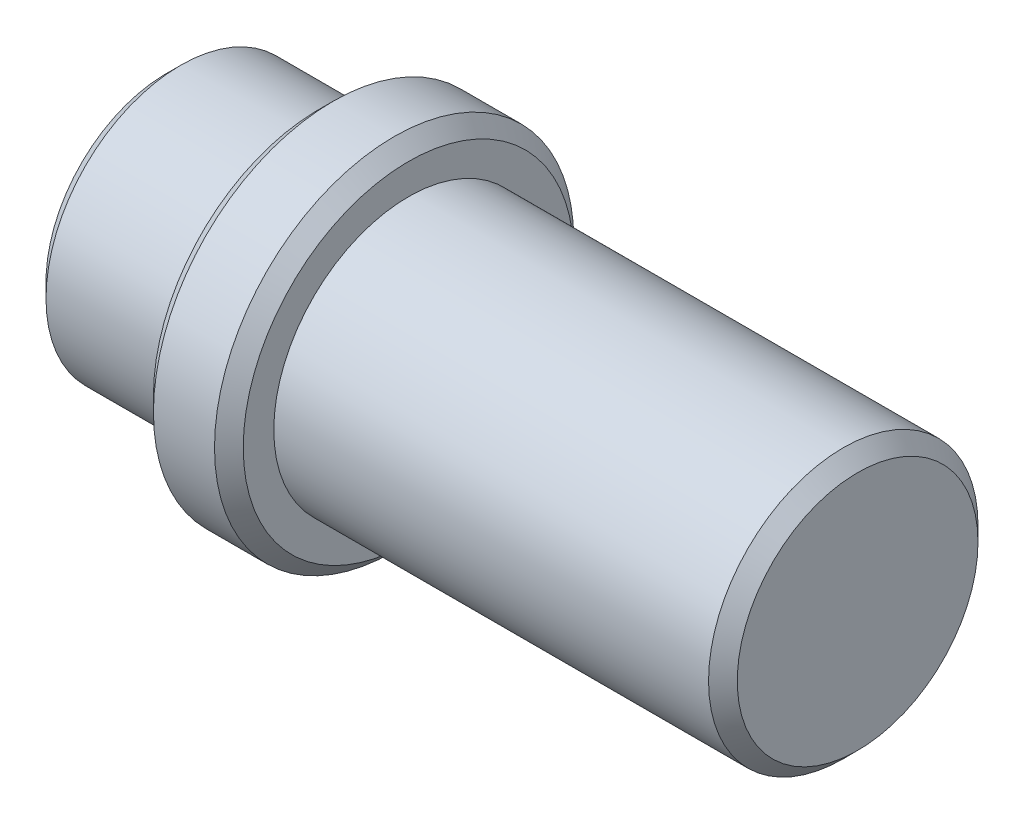
ISO-10303-21;
HEADER;
FILE_DESCRIPTION(('STEP AP214'),'2;1');
FILE_NAME('part.step','',(''),(''),'','','');
FILE_SCHEMA(('AUTOMOTIVE_DESIGN { 1 0 10303 214 1 1 1 1 }'));
ENDSEC;
DATA;
#1=APPLICATION_CONTEXT('core data for automotive mechanical design processes');
#2=APPLICATION_PROTOCOL_DEFINITION('international standard','automotive_design',2000,#1);
#3=PRODUCT_CONTEXT('',#1,'mechanical');
#4=PRODUCT('Part','Part','',(#3));
#5=PRODUCT_RELATED_PRODUCT_CATEGORY('part','',(#4));
#6=PRODUCT_DEFINITION_FORMATION('','',#4);
#7=PRODUCT_DEFINITION_CONTEXT('part definition',#1,'design');
#8=PRODUCT_DEFINITION('design','',#6,#7);
#9=PRODUCT_DEFINITION_SHAPE('','',#8);
#10=(LENGTH_UNIT() NAMED_UNIT(*) SI_UNIT(.MILLI.,.METRE.));
#11=(NAMED_UNIT(*) PLANE_ANGLE_UNIT() SI_UNIT($,.RADIAN.));
#12=(NAMED_UNIT(*) SI_UNIT($,.STERADIAN.) SOLID_ANGLE_UNIT());
#13=UNCERTAINTY_MEASURE_WITH_UNIT(LENGTH_MEASURE(1.E-05),#10,'distance_accuracy_value','');
#14=(GEOMETRIC_REPRESENTATION_CONTEXT(3) GLOBAL_UNCERTAINTY_ASSIGNED_CONTEXT((#13)) GLOBAL_UNIT_ASSIGNED_CONTEXT((#10,
#11,#12)) REPRESENTATION_CONTEXT('',''));
#15=CARTESIAN_POINT('',(0.,0.,0.));
#16=DIRECTION('',(0.,0.,1.));
#17=DIRECTION('',(1.,0.,0.));
#18=AXIS2_PLACEMENT_3D('',#15,#16,#17);
#19=CARTESIAN_POINT('',(12.2174,0.,0.));
#20=DIRECTION('',(-1.,0.,0.));
#21=DIRECTION('',(0.,0.,1.));
#22=AXIS2_PLACEMENT_3D('',#19,#20,#21);
#23=CYLINDRICAL_SURFACE('',#22,2.38125);
#24=CARTESIAN_POINT('',(11.9634,0.,0.));
#25=DIRECTION('',(1.,0.,0.));
#26=DIRECTION('',(0.,0.,-1.));
#27=AXIS2_PLACEMENT_3D('',#24,#25,#26);
#28=CIRCLE('',#27,2.38125);
#29=CARTESIAN_POINT('',(11.9634,0.,-2.38125));
#30=VERTEX_POINT('',#29);
#31=EDGE_CURVE('E10',#30,#30,#28,.F.);
#32=ORIENTED_EDGE('',*,*,#31,.T.);
#33=EDGE_LOOP('',(#32));
#34=FACE_BOUND('',#33,.T.);
#35=CARTESIAN_POINT('',(4.2799,0.,0.));
#36=DIRECTION('',(-1.,0.,0.));
#37=DIRECTION('',(0.,0.,1.));
#38=AXIS2_PLACEMENT_3D('',#35,#36,#37);
#39=CIRCLE('',#38,2.38125);
#40=CARTESIAN_POINT('',(4.2799,0.,2.38125));
#41=VERTEX_POINT('',#40);
#42=EDGE_CURVE('E64',#41,#41,#39,.T.);
#43=ORIENTED_EDGE('',*,*,#42,.F.);
#44=EDGE_LOOP('',(#43));
#45=FACE_BOUND('',#44,.T.);
#46=ADVANCED_FACE('F32',(#34,#45),#23,.T.);
#47=CARTESIAN_POINT('',(12.2174,0.,0.));
#48=DIRECTION('',(1.,0.,0.));
#49=DIRECTION('',(0.,0.,-1.));
#50=AXIS2_PLACEMENT_3D('',#47,#48,#49);
#51=PLANE('',#50);
#52=CARTESIAN_POINT('',(12.2174,0.,0.));
#53=DIRECTION('',(1.,0.,0.));
#54=DIRECTION('',(0.,0.,-1.));
#55=AXIS2_PLACEMENT_3D('',#52,#53,#54);
#56=CIRCLE('',#55,2.12725);
#57=CARTESIAN_POINT('',(12.2174,0.,-2.12725));
#58=VERTEX_POINT('',#57);
#59=EDGE_CURVE('E39',#58,#58,#56,.T.);
#60=ORIENTED_EDGE('',*,*,#59,.T.);
#61=EDGE_LOOP('',(#60));
#62=FACE_BOUND('',#61,.T.);
#63=ADVANCED_FACE('F86',(#62),#51,.T.);
#64=CARTESIAN_POINT('',(4.2799,0.,0.));
#65=DIRECTION('',(-1.,0.,0.));
#66=DIRECTION('',(0.,0.,1.));
#67=AXIS2_PLACEMENT_3D('',#64,#65,#66);
#68=PLANE('',#67);
#69=CARTESIAN_POINT('',(4.2799,0.,0.));
#70=DIRECTION('',(-1.,0.,0.));
#71=DIRECTION('',(0.,0.,1.));
#72=AXIS2_PLACEMENT_3D('',#69,#70,#71);
#73=CIRCLE('',#72,2.921);
#74=CARTESIAN_POINT('',(4.2799,0.,2.921));
#75=VERTEX_POINT('',#74);
#76=EDGE_CURVE('E55',#75,#75,#73,.F.);
#77=ORIENTED_EDGE('',*,*,#76,.T.);
#78=EDGE_LOOP('',(#77));
#79=FACE_BOUND('',#78,.T.);
#80=ORIENTED_EDGE('',*,*,#42,.T.);
#81=EDGE_LOOP('',(#80));
#82=FACE_BOUND('',#81,.T.);
#83=ADVANCED_FACE('F76',(#79,#82),#68,.F.);
#84=CARTESIAN_POINT('',(2.6924,0.,0.));
#85=DIRECTION('',(-1.,0.,0.));
#86=DIRECTION('',(0.,0.,1.));
#87=AXIS2_PLACEMENT_3D('',#84,#85,#86);
#88=PLANE('',#87);
#89=CARTESIAN_POINT('',(2.6924,0.,0.));
#90=DIRECTION('',(-1.,0.,0.));
#91=DIRECTION('',(0.,0.,1.));
#92=AXIS2_PLACEMENT_3D('',#89,#90,#91);
#93=CIRCLE('',#92,2.921);
#94=CARTESIAN_POINT('',(2.6924,0.,2.921));
#95=VERTEX_POINT('',#94);
#96=EDGE_CURVE('E52',#95,#95,#93,.T.);
#97=ORIENTED_EDGE('',*,*,#96,.T.);
#98=EDGE_LOOP('',(#97));
#99=FACE_BOUND('',#98,.T.);
#100=CARTESIAN_POINT('',(2.6924,0.,0.));
#101=DIRECTION('',(-1.,0.,0.));
#102=DIRECTION('',(0.,0.,1.));
#103=AXIS2_PLACEMENT_3D('',#100,#101,#102);
#104=CIRCLE('',#103,2.38125);
#105=CARTESIAN_POINT('',(2.6924,0.,2.38125));
#106=VERTEX_POINT('',#105);
#107=EDGE_CURVE('E67',#106,#106,#104,.T.);
#108=ORIENTED_EDGE('',*,*,#107,.F.);
#109=EDGE_LOOP('',(#108));
#110=FACE_BOUND('',#109,.T.);
#111=ADVANCED_FACE('F73',(#99,#110),#88,.T.);
#112=CARTESIAN_POINT('',(4.2799,0.,0.));
#113=DIRECTION('',(-1.,0.,0.));
#114=DIRECTION('',(0.,0.,1.));
#115=AXIS2_PLACEMENT_3D('',#112,#113,#114);
#116=CYLINDRICAL_SURFACE('',#115,3.175);
#117=CARTESIAN_POINT('',(4.0259,0.,0.));
#118=DIRECTION('',(-1.,0.,0.));
#119=DIRECTION('',(0.,0.,1.));
#120=AXIS2_PLACEMENT_3D('',#117,#118,#119);
#121=CIRCLE('',#120,3.175);
#122=CARTESIAN_POINT('',(4.0259,0.,3.175));
#123=VERTEX_POINT('',#122);
#124=EDGE_CURVE('E58',#123,#123,#121,.T.);
#125=ORIENTED_EDGE('',*,*,#124,.T.);
#126=EDGE_LOOP('',(#125));
#127=FACE_BOUND('',#126,.T.);
#128=CARTESIAN_POINT('',(2.9464,0.,0.));
#129=DIRECTION('',(-1.,0.,0.));
#130=DIRECTION('',(0.,0.,1.));
#131=AXIS2_PLACEMENT_3D('',#128,#129,#130);
#132=CIRCLE('',#131,3.175);
#133=CARTESIAN_POINT('',(2.9464,0.,3.175));
#134=VERTEX_POINT('',#133);
#135=EDGE_CURVE('E61',#134,#134,#132,.F.);
#136=ORIENTED_EDGE('',*,*,#135,.T.);
#137=EDGE_LOOP('',(#136));
#138=FACE_BOUND('',#137,.T.);
#139=ADVANCED_FACE('F75',(#127,#138),#116,.T.);
#140=CARTESIAN_POINT('',(0.,0.,0.));
#141=DIRECTION('',(1.,0.,0.));
#142=DIRECTION('',(0.,0.,-1.));
#143=AXIS2_PLACEMENT_3D('',#140,#141,#142);
#144=PLANE('',#143);
#145=CARTESIAN_POINT('',(0.,0.,0.));
#146=DIRECTION('',(1.,0.,0.));
#147=DIRECTION('',(0.,0.,-1.));
#148=AXIS2_PLACEMENT_3D('',#145,#146,#147);
#149=CIRCLE('',#148,2.12725);
#150=CARTESIAN_POINT('',(0.,0.,-2.12725));
#151=VERTEX_POINT('',#150);
#152=EDGE_CURVE('E43',#151,#151,#149,.F.);
#153=ORIENTED_EDGE('',*,*,#152,.T.);
#154=EDGE_LOOP('',(#153));
#155=FACE_BOUND('',#154,.T.);
#156=ADVANCED_FACE('F83',(#155),#144,.F.);
#157=CARTESIAN_POINT('',(0.253999999999999,0.,0.));
#158=DIRECTION('',(1.,0.,0.));
#159=DIRECTION('',(0.,0.,-1.));
#160=AXIS2_PLACEMENT_3D('',#157,#158,#159);
#161=CIRCLE('',#160,2.38125);
#162=CARTESIAN_POINT('',(0.253999999999999,0.,-2.38125));
#163=VERTEX_POINT('',#162);
#164=EDGE_CURVE('E47',#163,#163,#161,.T.);
#165=ORIENTED_EDGE('',*,*,#164,.T.);
#166=EDGE_LOOP('',(#165));
#167=FACE_BOUND('',#166,.T.);
#168=ORIENTED_EDGE('',*,*,#107,.T.);
#169=EDGE_LOOP('',(#168));
#170=FACE_BOUND('',#169,.T.);
#171=ADVANCED_FACE('F71',(#167,#170),#23,.T.);
#172=CARTESIAN_POINT('',(4.0259,0.,0.));
#173=DIRECTION('',(-1.,0.,0.));
#174=DIRECTION('',(0.,0.,1.));
#175=AXIS2_PLACEMENT_3D('',#172,#173,#174);
#176=CONICAL_SURFACE('',#175,3.175,0.785398163397451);
#177=ORIENTED_EDGE('',*,*,#76,.F.);
#178=EDGE_LOOP('',(#177));
#179=FACE_BOUND('',#178,.T.);
#180=ORIENTED_EDGE('',*,*,#124,.F.);
#181=EDGE_LOOP('',(#180));
#182=FACE_BOUND('',#181,.T.);
#183=ADVANCED_FACE('F99',(#179,#182),#176,.T.);
#184=CARTESIAN_POINT('',(2.6924,0.,0.));
#185=DIRECTION('',(1.,0.,0.));
#186=DIRECTION('',(0.,0.,-1.));
#187=AXIS2_PLACEMENT_3D('',#184,#185,#186);
#188=CONICAL_SURFACE('',#187,2.921,0.785398163397444);
#189=ORIENTED_EDGE('',*,*,#135,.F.);
#190=EDGE_LOOP('',(#189));
#191=FACE_BOUND('',#190,.T.);
#192=ORIENTED_EDGE('',*,*,#96,.F.);
#193=EDGE_LOOP('',(#192));
#194=FACE_BOUND('',#193,.T.);
#195=ADVANCED_FACE('F105',(#191,#194),#188,.T.);
#196=CARTESIAN_POINT('',(0.253999999999999,0.,0.));
#197=DIRECTION('',(1.,0.,0.));
#198=DIRECTION('',(0.,0.,-1.));
#199=AXIS2_PLACEMENT_3D('',#196,#197,#198);
#200=CONICAL_SURFACE('',#199,2.38125,0.785398163397448);
#201=ORIENTED_EDGE('',*,*,#152,.F.);
#202=EDGE_LOOP('',(#201));
#203=FACE_BOUND('',#202,.T.);
#204=ORIENTED_EDGE('',*,*,#164,.F.);
#205=EDGE_LOOP('',(#204));
#206=FACE_BOUND('',#205,.T.);
#207=ADVANCED_FACE('F110',(#203,#206),#200,.T.);
#208=CARTESIAN_POINT('',(12.2174,0.,0.));
#209=DIRECTION('',(-1.,0.,0.));
#210=DIRECTION('',(0.,0.,1.));
#211=AXIS2_PLACEMENT_3D('',#208,#209,#210);
#212=CONICAL_SURFACE('',#211,2.12725,0.785398163397445);
#213=ORIENTED_EDGE('',*,*,#31,.F.);
#214=EDGE_LOOP('',(#213));
#215=FACE_BOUND('',#214,.T.);
#216=ORIENTED_EDGE('',*,*,#59,.F.);
#217=EDGE_LOOP('',(#216));
#218=FACE_BOUND('',#217,.T.);
#219=ADVANCED_FACE('F34',(#215,#218),#212,.T.);
#220=CLOSED_SHELL('',(#46,#63,#83,#111,#139,#156,#171,#183,#195,#207,#219));
#221=MANIFOLD_SOLID_BREP('B2',#220);
#222=ADVANCED_BREP_SHAPE_REPRESENTATION('',(#18,#221),#14);
#223=SHAPE_DEFINITION_REPRESENTATION(#9,#222);
ENDSEC;
END-ISO-10303-21;
